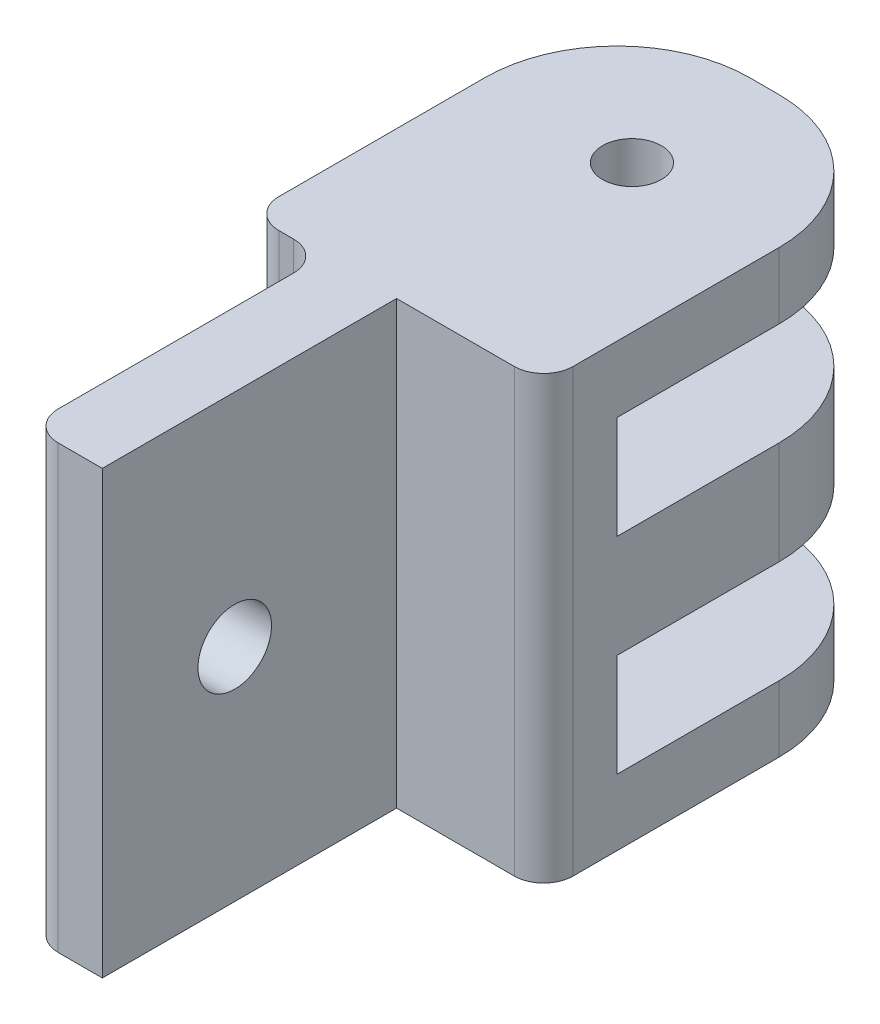
ISO-10303-21;
HEADER;
FILE_DESCRIPTION(('STEP AP214'),'2;1');
FILE_NAME('part.step','',(''),(''),'','','');
FILE_SCHEMA(('AUTOMOTIVE_DESIGN { 1 0 10303 214 1 1 1 1 }'));
ENDSEC;
DATA;
#1=APPLICATION_CONTEXT('core data for automotive mechanical design processes');
#2=APPLICATION_PROTOCOL_DEFINITION('international standard','automotive_design',2000,#1);
#3=PRODUCT_CONTEXT('',#1,'mechanical');
#4=PRODUCT('Part','Part','',(#3));
#5=PRODUCT_RELATED_PRODUCT_CATEGORY('part','',(#4));
#6=PRODUCT_DEFINITION_FORMATION('','',#4);
#7=PRODUCT_DEFINITION_CONTEXT('part definition',#1,'design');
#8=PRODUCT_DEFINITION('design','',#6,#7);
#9=PRODUCT_DEFINITION_SHAPE('','',#8);
#10=(LENGTH_UNIT() NAMED_UNIT(*) SI_UNIT(.MILLI.,.METRE.));
#11=(NAMED_UNIT(*) PLANE_ANGLE_UNIT() SI_UNIT($,.RADIAN.));
#12=(NAMED_UNIT(*) SI_UNIT($,.STERADIAN.) SOLID_ANGLE_UNIT());
#13=UNCERTAINTY_MEASURE_WITH_UNIT(LENGTH_MEASURE(1.E-05),#10,'distance_accuracy_value','');
#14=(GEOMETRIC_REPRESENTATION_CONTEXT(3) GLOBAL_UNCERTAINTY_ASSIGNED_CONTEXT((#13)) GLOBAL_UNIT_ASSIGNED_CONTEXT((#10,
#11,#12)) REPRESENTATION_CONTEXT('',''));
#15=CARTESIAN_POINT('',(0.,0.,0.));
#16=DIRECTION('',(0.,0.,1.));
#17=DIRECTION('',(1.,0.,0.));
#18=AXIS2_PLACEMENT_3D('',#15,#16,#17);
#19=CARTESIAN_POINT('',(0.,0.,25.));
#20=DIRECTION('',(0.,0.,-1.));
#21=DIRECTION('',(-1.,0.,0.));
#22=AXIS2_PLACEMENT_3D('',#19,#20,#21);
#23=PLANE('',#22);
#24=DIRECTION('',(1.,0.,0.));
#25=VECTOR('',#24,1.);
#26=CARTESIAN_POINT('',(-10.,-15.,25.));
#27=LINE('',#26,#25);
#28=CARTESIAN_POINT('',(0.,-15.,25.));
#29=VERTEX_POINT('',#28);
#30=CARTESIAN_POINT('',(8.,-15.,25.));
#31=VERTEX_POINT('',#30);
#32=EDGE_CURVE('E329',#29,#31,#27,.T.);
#33=ORIENTED_EDGE('',*,*,#32,.T.);
#34=DIRECTION('',(0.,1.,0.));
#35=VECTOR('',#34,1.);
#36=CARTESIAN_POINT('',(8.,0.,25.));
#37=LINE('',#36,#35);
#38=CARTESIAN_POINT('',(8.,15.,25.));
#39=VERTEX_POINT('',#38);
#40=EDGE_CURVE('E472',#31,#39,#37,.T.);
#41=ORIENTED_EDGE('',*,*,#40,.T.);
#42=DIRECTION('',(-1.,0.,0.));
#43=VECTOR('',#42,1.);
#44=CARTESIAN_POINT('',(-10.,15.,25.));
#45=LINE('',#44,#43);
#46=CARTESIAN_POINT('',(0.,15.,25.));
#47=VERTEX_POINT('',#46);
#48=EDGE_CURVE('E326',#39,#47,#45,.T.);
#49=ORIENTED_EDGE('',*,*,#48,.T.);
#50=DIRECTION('',(0.,1.,0.));
#51=VECTOR('',#50,1.);
#52=CARTESIAN_POINT('',(0.,-15.,25.));
#53=LINE('',#52,#51);
#54=EDGE_CURVE('E236',#29,#47,#53,.T.);
#55=ORIENTED_EDGE('',*,*,#54,.F.);
#56=EDGE_LOOP('',(#33,#41,#49,#55));
#57=FACE_BOUND('',#56,.T.);
#58=ADVANCED_FACE('F43',(#57),#23,.F.);
#59=CARTESIAN_POINT('',(-7.,15.,25.));
#60=VERTEX_POINT('',#59);
#61=CARTESIAN_POINT('',(-8.,15.,25.));
#62=VERTEX_POINT('',#61);
#63=EDGE_CURVE('E330',#60,#62,#45,.T.);
#64=ORIENTED_EDGE('',*,*,#63,.T.);
#65=DIRECTION('',(0.,-1.,0.));
#66=VECTOR('',#65,1.);
#67=CARTESIAN_POINT('',(-8.,0.,25.));
#68=LINE('',#67,#66);
#69=CARTESIAN_POINT('',(-8.,-15.,25.));
#70=VERTEX_POINT('',#69);
#71=EDGE_CURVE('E448',#62,#70,#68,.T.);
#72=ORIENTED_EDGE('',*,*,#71,.T.);
#73=CARTESIAN_POINT('',(-7.,-15.,25.));
#74=VERTEX_POINT('',#73);
#75=EDGE_CURVE('E331',#70,#74,#27,.T.);
#76=ORIENTED_EDGE('',*,*,#75,.T.);
#77=DIRECTION('',(0.,-1.,0.));
#78=VECTOR('',#77,1.);
#79=CARTESIAN_POINT('',(-7.,15.,25.));
#80=LINE('',#79,#78);
#81=EDGE_CURVE('E440',#74,#60,#80,.F.);
#82=ORIENTED_EDGE('',*,*,#81,.T.);
#83=EDGE_LOOP('',(#64,#72,#76,#82));
#84=FACE_BOUND('',#83,.T.);
#85=ADVANCED_FACE('F497',(#84),#23,.F.);
#86=CARTESIAN_POINT('',(0.,0.,0.));
#87=DIRECTION('',(0.,0.,-1.));
#88=DIRECTION('',(-1.,0.,0.));
#89=AXIS2_PLACEMENT_3D('',#86,#87,#88);
#90=PLANE('',#89);
#91=DIRECTION('',(1.,0.,0.));
#92=VECTOR('',#91,1.);
#93=CARTESIAN_POINT('',(10.,10.5,0.));
#94=LINE('',#93,#92);
#95=CARTESIAN_POINT('',(-1.,10.5,0.));
#96=VERTEX_POINT('',#95);
#97=CARTESIAN_POINT('',(1.,10.5,0.));
#98=VERTEX_POINT('',#97);
#99=EDGE_CURVE('E257',#96,#98,#94,.T.);
#100=ORIENTED_EDGE('',*,*,#99,.F.);
#101=DIRECTION('',(0.,-1.,0.));
#102=VECTOR('',#101,1.);
#103=CARTESIAN_POINT('',(-1.,15.,0.));
#104=LINE('',#103,#102);
#105=CARTESIAN_POINT('',(-1.,15.,0.));
#106=VERTEX_POINT('',#105);
#107=EDGE_CURVE('E430',#96,#106,#104,.F.);
#108=ORIENTED_EDGE('',*,*,#107,.T.);
#109=DIRECTION('',(-1.,0.,0.));
#110=VECTOR('',#109,1.);
#111=CARTESIAN_POINT('',(-10.,15.,0.));
#112=LINE('',#111,#110);
#113=CARTESIAN_POINT('',(1.,15.,0.));
#114=VERTEX_POINT('',#113);
#115=EDGE_CURVE('E281',#114,#106,#112,.T.);
#116=ORIENTED_EDGE('',*,*,#115,.F.);
#117=DIRECTION('',(0.,1.,0.));
#118=VECTOR('',#117,1.);
#119=CARTESIAN_POINT('',(1.,10.5,0.));
#120=LINE('',#119,#118);
#121=EDGE_CURVE('E427',#114,#98,#120,.F.);
#122=ORIENTED_EDGE('',*,*,#121,.T.);
#123=EDGE_LOOP('',(#100,#108,#116,#122));
#124=FACE_BOUND('',#123,.T.);
#125=ADVANCED_FACE('F548',(#124),#90,.T.);
#126=DIRECTION('',(-1.,0.,0.));
#127=VECTOR('',#126,1.);
#128=CARTESIAN_POINT('',(-10.,-10.5,0.));
#129=LINE('',#128,#127);
#130=CARTESIAN_POINT('',(1.,-10.5,0.));
#131=VERTEX_POINT('',#130);
#132=CARTESIAN_POINT('',(-1.,-10.5,0.));
#133=VERTEX_POINT('',#132);
#134=EDGE_CURVE('E305',#131,#133,#129,.T.);
#135=ORIENTED_EDGE('',*,*,#134,.F.);
#136=DIRECTION('',(0.,1.,0.));
#137=VECTOR('',#136,1.);
#138=CARTESIAN_POINT('',(1.,-15.,0.));
#139=LINE('',#138,#137);
#140=CARTESIAN_POINT('',(1.,-15.,0.));
#141=VERTEX_POINT('',#140);
#142=EDGE_CURVE('E381',#131,#141,#139,.F.);
#143=ORIENTED_EDGE('',*,*,#142,.T.);
#144=DIRECTION('',(1.,0.,0.));
#145=VECTOR('',#144,1.);
#146=CARTESIAN_POINT('',(-10.,-15.,0.));
#147=LINE('',#146,#145);
#148=CARTESIAN_POINT('',(-1.,-15.,0.));
#149=VERTEX_POINT('',#148);
#150=EDGE_CURVE('E339',#149,#141,#147,.T.);
#151=ORIENTED_EDGE('',*,*,#150,.F.);
#152=DIRECTION('',(0.,-1.,0.));
#153=VECTOR('',#152,1.);
#154=CARTESIAN_POINT('',(-1.,-10.5,0.));
#155=LINE('',#154,#153);
#156=EDGE_CURVE('E378',#149,#133,#155,.F.);
#157=ORIENTED_EDGE('',*,*,#156,.T.);
#158=EDGE_LOOP('',(#135,#143,#151,#157));
#159=FACE_BOUND('',#158,.T.);
#160=ADVANCED_FACE('F521',(#159),#90,.T.);
#161=CARTESIAN_POINT('',(10.,-15.,25.));
#162=DIRECTION('',(-1.,0.,0.));
#163=DIRECTION('',(0.,0.,1.));
#164=AXIS2_PLACEMENT_3D('',#161,#162,#163);
#165=PLANE('',#164);
#166=DIRECTION('',(0.,0.,-1.));
#167=VECTOR('',#166,1.);
#168=CARTESIAN_POINT('',(10.,15.,25.));
#169=LINE('',#168,#167);
#170=CARTESIAN_POINT('',(10.,15.,23.));
#171=VERTEX_POINT('',#170);
#172=CARTESIAN_POINT('',(10.,15.,9.));
#173=VERTEX_POINT('',#172);
#174=EDGE_CURVE('E351',#171,#173,#169,.T.);
#175=ORIENTED_EDGE('',*,*,#174,.F.);
#176=DIRECTION('',(0.,1.,0.));
#177=VECTOR('',#176,1.);
#178=CARTESIAN_POINT('',(10.,-15.,23.));
#179=LINE('',#178,#177);
#180=CARTESIAN_POINT('',(10.,-15.,23.));
#181=VERTEX_POINT('',#180);
#182=EDGE_CURVE('E479',#171,#181,#179,.F.);
#183=ORIENTED_EDGE('',*,*,#182,.T.);
#184=DIRECTION('',(0.,0.,-1.));
#185=VECTOR('',#184,1.);
#186=CARTESIAN_POINT('',(10.,-15.,25.));
#187=LINE('',#186,#185);
#188=CARTESIAN_POINT('',(10.,-15.,9.));
#189=VERTEX_POINT('',#188);
#190=EDGE_CURVE('E335',#181,#189,#187,.T.);
#191=ORIENTED_EDGE('',*,*,#190,.T.);
#192=DIRECTION('',(0.,1.,0.));
#193=VECTOR('',#192,1.);
#194=CARTESIAN_POINT('',(10.,-10.5,9.));
#195=LINE('',#194,#193);
#196=CARTESIAN_POINT('',(10.,-10.5,9.));
#197=VERTEX_POINT('',#196);
#198=EDGE_CURVE('E368',#189,#197,#195,.T.);
#199=ORIENTED_EDGE('',*,*,#198,.T.);
#200=DIRECTION('',(0.,0.,-1.));
#201=VECTOR('',#200,1.);
#202=CARTESIAN_POINT('',(10.,-10.5,20.));
#203=LINE('',#202,#201);
#204=CARTESIAN_POINT('',(10.,-10.5,20.));
#205=VERTEX_POINT('',#204);
#206=EDGE_CURVE('E246',#205,#197,#203,.T.);
#207=ORIENTED_EDGE('',*,*,#206,.F.);
#208=DIRECTION('',(0.,-1.,0.));
#209=VECTOR('',#208,1.);
#210=CARTESIAN_POINT('',(10.,-3.50245487564618,20.));
#211=LINE('',#210,#209);
#212=CARTESIAN_POINT('',(10.,-3.50245487564618,20.));
#213=VERTEX_POINT('',#212);
#214=EDGE_CURVE('E316',#213,#205,#211,.T.);
#215=ORIENTED_EDGE('',*,*,#214,.F.);
#216=DIRECTION('',(0.,0.,-1.));
#217=VECTOR('',#216,1.);
#218=CARTESIAN_POINT('',(10.,-3.50245487564618,20.));
#219=LINE('',#218,#217);
#220=CARTESIAN_POINT('',(10.,-3.50245487564618,9.));
#221=VERTEX_POINT('',#220);
#222=EDGE_CURVE('E298',#213,#221,#219,.T.);
#223=ORIENTED_EDGE('',*,*,#222,.T.);
#224=DIRECTION('',(0.,1.,0.));
#225=VECTOR('',#224,1.);
#226=CARTESIAN_POINT('',(10.,3.5,9.));
#227=LINE('',#226,#225);
#228=CARTESIAN_POINT('',(10.,3.5,9.));
#229=VERTEX_POINT('',#228);
#230=EDGE_CURVE('E364',#221,#229,#227,.T.);
#231=ORIENTED_EDGE('',*,*,#230,.T.);
#232=DIRECTION('',(0.,0.,-1.));
#233=VECTOR('',#232,1.);
#234=CARTESIAN_POINT('',(10.,3.5,20.));
#235=LINE('',#234,#233);
#236=CARTESIAN_POINT('',(10.,3.5,20.));
#237=VERTEX_POINT('',#236);
#238=EDGE_CURVE('E268',#237,#229,#235,.T.);
#239=ORIENTED_EDGE('',*,*,#238,.F.);
#240=DIRECTION('',(0.,-1.,0.));
#241=VECTOR('',#240,1.);
#242=CARTESIAN_POINT('',(10.,10.5,20.));
#243=LINE('',#242,#241);
#244=CARTESIAN_POINT('',(10.,10.5,20.));
#245=VERTEX_POINT('',#244);
#246=EDGE_CURVE('E252',#245,#237,#243,.T.);
#247=ORIENTED_EDGE('',*,*,#246,.F.);
#248=DIRECTION('',(0.,0.,-1.));
#249=VECTOR('',#248,1.);
#250=CARTESIAN_POINT('',(10.,10.5,20.));
#251=LINE('',#250,#249);
#252=CARTESIAN_POINT('',(10.,10.5,9.));
#253=VERTEX_POINT('',#252);
#254=EDGE_CURVE('E277',#245,#253,#251,.T.);
#255=ORIENTED_EDGE('',*,*,#254,.T.);
#256=DIRECTION('',(0.,1.,0.));
#257=VECTOR('',#256,1.);
#258=CARTESIAN_POINT('',(10.,15.,9.));
#259=LINE('',#258,#257);
#260=EDGE_CURVE('E354',#253,#173,#259,.T.);
#261=ORIENTED_EDGE('',*,*,#260,.T.);
#262=EDGE_LOOP('',(#175,#183,#191,#199,#207,#215,#223,#231,#239,#247,#255,#261));
#263=FACE_BOUND('',#262,.T.);
#264=ADVANCED_FACE('F537',(#263),#165,.F.);
#265=CARTESIAN_POINT('',(-10.,15.,25.));
#266=DIRECTION('',(0.,-1.,0.));
#267=DIRECTION('',(0.,0.,-1.));
#268=AXIS2_PLACEMENT_3D('',#265,#266,#267);
#269=PLANE('',#268);
#270=CARTESIAN_POINT('',(0.,15.,9.00000000000006));
#271=DIRECTION('',(0.,-1.,0.));
#272=DIRECTION('',(0.,0.,-1.));
#273=AXIS2_PLACEMENT_3D('',#270,#271,#272);
#274=CIRCLE('',#273,2.);
#275=CARTESIAN_POINT('',(0.,15.,7.00000000000006));
#276=VERTEX_POINT('',#275);
#277=EDGE_CURVE('E360',#276,#276,#274,.F.);
#278=ORIENTED_EDGE('',*,*,#277,.F.);
#279=EDGE_LOOP('',(#278));
#280=FACE_BOUND('',#279,.T.);
#281=DIRECTION('',(0.,0.,-1.));
#282=VECTOR('',#281,1.);
#283=CARTESIAN_POINT('',(-5.,15.,45.));
#284=LINE('',#283,#282);
#285=CARTESIAN_POINT('',(-5.,15.,43.));
#286=VERTEX_POINT('',#285);
#287=CARTESIAN_POINT('',(-5.,15.,27.));
#288=VERTEX_POINT('',#287);
#289=EDGE_CURVE('E241',#286,#288,#284,.T.);
#290=ORIENTED_EDGE('',*,*,#289,.F.);
#291=CARTESIAN_POINT('',(-3.,15.,43.));
#292=DIRECTION('',(0.,-1.,0.));
#293=DIRECTION('',(0.,0.,-1.));
#294=AXIS2_PLACEMENT_3D('',#291,#292,#293);
#295=CIRCLE('',#294,2.);
#296=CARTESIAN_POINT('',(-3.,15.,45.));
#297=VERTEX_POINT('',#296);
#298=EDGE_CURVE('E11',#286,#297,#295,.F.);
#299=ORIENTED_EDGE('',*,*,#298,.T.);
#300=DIRECTION('',(-1.,0.,0.));
#301=VECTOR('',#300,1.);
#302=CARTESIAN_POINT('',(0.,15.,45.));
#303=LINE('',#302,#301);
#304=CARTESIAN_POINT('',(0.,15.,45.));
#305=VERTEX_POINT('',#304);
#306=EDGE_CURVE('E215',#305,#297,#303,.T.);
#307=ORIENTED_EDGE('',*,*,#306,.F.);
#308=DIRECTION('',(0.,0.,-1.));
#309=VECTOR('',#308,1.);
#310=CARTESIAN_POINT('',(0.,15.,45.));
#311=LINE('',#310,#309);
#312=EDGE_CURVE('E220',#305,#47,#311,.T.);
#313=ORIENTED_EDGE('',*,*,#312,.T.);
#314=ORIENTED_EDGE('',*,*,#48,.F.);
#315=CARTESIAN_POINT('',(8.,15.,23.));
#316=DIRECTION('',(0.,-1.,0.));
#317=DIRECTION('',(0.,0.,-1.));
#318=AXIS2_PLACEMENT_3D('',#315,#316,#317);
#319=CIRCLE('',#318,2.);
#320=EDGE_CURVE('E476',#39,#171,#319,.F.);
#321=ORIENTED_EDGE('',*,*,#320,.T.);
#322=ORIENTED_EDGE('',*,*,#174,.T.);
#323=CARTESIAN_POINT('',(1.,15.,9.));
#324=DIRECTION('',(0.,-1.,0.));
#325=DIRECTION('',(0.,0.,-1.));
#326=AXIS2_PLACEMENT_3D('',#323,#324,#325);
#327=CIRCLE('',#326,9.);
#328=EDGE_CURVE('E433',#173,#114,#327,.F.);
#329=ORIENTED_EDGE('',*,*,#328,.T.);
#330=ORIENTED_EDGE('',*,*,#115,.T.);
#331=CARTESIAN_POINT('',(-1.,15.,9.));
#332=DIRECTION('',(0.,-1.,0.));
#333=DIRECTION('',(0.,0.,-1.));
#334=AXIS2_PLACEMENT_3D('',#331,#332,#333);
#335=CIRCLE('',#334,9.);
#336=CARTESIAN_POINT('',(-10.,15.,9.));
#337=VERTEX_POINT('',#336);
#338=EDGE_CURVE('E436',#106,#337,#335,.F.);
#339=ORIENTED_EDGE('',*,*,#338,.T.);
#340=DIRECTION('',(0.,0.,-1.));
#341=VECTOR('',#340,1.);
#342=CARTESIAN_POINT('',(-10.,15.,25.));
#343=LINE('',#342,#341);
#344=CARTESIAN_POINT('',(-10.,15.,23.));
#345=VERTEX_POINT('',#344);
#346=EDGE_CURVE('E348',#345,#337,#343,.T.);
#347=ORIENTED_EDGE('',*,*,#346,.F.);
#348=CARTESIAN_POINT('',(-8.,15.,23.));
#349=DIRECTION('',(0.,-1.,0.));
#350=DIRECTION('',(0.,0.,-1.));
#351=AXIS2_PLACEMENT_3D('',#348,#349,#350);
#352=CIRCLE('',#351,2.);
#353=EDGE_CURVE('E458',#345,#62,#352,.F.);
#354=ORIENTED_EDGE('',*,*,#353,.T.);
#355=ORIENTED_EDGE('',*,*,#63,.F.);
#356=CARTESIAN_POINT('',(-7.,15.,27.));
#357=DIRECTION('',(0.,-1.,0.));
#358=DIRECTION('',(0.,0.,-1.));
#359=AXIS2_PLACEMENT_3D('',#356,#357,#358);
#360=CIRCLE('',#359,2.);
#361=EDGE_CURVE('E468',#60,#288,#360,.T.);
#362=ORIENTED_EDGE('',*,*,#361,.T.);
#363=EDGE_LOOP('',(#290,#299,#307,#313,#314,#321,#322,#329,#330,#339,#347,#354,#355,#362));
#364=FACE_BOUND('',#363,.T.);
#365=ADVANCED_FACE('F217',(#280,#364),#269,.F.);
#366=CARTESIAN_POINT('',(-10.,-15.,25.));
#367=DIRECTION('',(1.,0.,0.));
#368=DIRECTION('',(0.,0.,-1.));
#369=AXIS2_PLACEMENT_3D('',#366,#367,#368);
#370=PLANE('',#369);
#371=DIRECTION('',(0.,0.,-1.));
#372=VECTOR('',#371,1.);
#373=CARTESIAN_POINT('',(-10.,-15.,25.));
#374=LINE('',#373,#372);
#375=CARTESIAN_POINT('',(-10.,-15.,23.));
#376=VERTEX_POINT('',#375);
#377=CARTESIAN_POINT('',(-10.,-15.,9.));
#378=VERTEX_POINT('',#377);
#379=EDGE_CURVE('E345',#376,#378,#374,.T.);
#380=ORIENTED_EDGE('',*,*,#379,.F.);
#381=DIRECTION('',(0.,-1.,0.));
#382=VECTOR('',#381,1.);
#383=CARTESIAN_POINT('',(-10.,-15.,23.));
#384=LINE('',#383,#382);
#385=EDGE_CURVE('E455',#376,#345,#384,.F.);
#386=ORIENTED_EDGE('',*,*,#385,.T.);
#387=ORIENTED_EDGE('',*,*,#346,.T.);
#388=DIRECTION('',(0.,-1.,0.));
#389=VECTOR('',#388,1.);
#390=CARTESIAN_POINT('',(-10.,10.5,9.));
#391=LINE('',#390,#389);
#392=CARTESIAN_POINT('',(-10.,10.5,9.));
#393=VERTEX_POINT('',#392);
#394=EDGE_CURVE('E391',#337,#393,#391,.T.);
#395=ORIENTED_EDGE('',*,*,#394,.T.);
#396=DIRECTION('',(0.,0.,-1.));
#397=VECTOR('',#396,1.);
#398=CARTESIAN_POINT('',(-10.,10.5,20.));
#399=LINE('',#398,#397);
#400=CARTESIAN_POINT('',(-10.,10.5,20.));
#401=VERTEX_POINT('',#400);
#402=EDGE_CURVE('E282',#401,#393,#399,.T.);
#403=ORIENTED_EDGE('',*,*,#402,.F.);
#404=DIRECTION('',(0.,1.,0.));
#405=VECTOR('',#404,1.);
#406=CARTESIAN_POINT('',(-10.,10.5,20.));
#407=LINE('',#406,#405);
#408=CARTESIAN_POINT('',(-10.,3.5,20.));
#409=VERTEX_POINT('',#408);
#410=EDGE_CURVE('E261',#409,#401,#407,.T.);
#411=ORIENTED_EDGE('',*,*,#410,.F.);
#412=DIRECTION('',(0.,0.,-1.));
#413=VECTOR('',#412,1.);
#414=CARTESIAN_POINT('',(-10.,3.5,20.));
#415=LINE('',#414,#413);
#416=CARTESIAN_POINT('',(-10.,3.5,9.));
#417=VERTEX_POINT('',#416);
#418=EDGE_CURVE('E286',#409,#417,#415,.T.);
#419=ORIENTED_EDGE('',*,*,#418,.T.);
#420=DIRECTION('',(0.,-1.,0.));
#421=VECTOR('',#420,1.);
#422=CARTESIAN_POINT('',(-10.,-3.50245487564618,9.));
#423=LINE('',#422,#421);
#424=CARTESIAN_POINT('',(-10.,-3.50245487564618,9.));
#425=VERTEX_POINT('',#424);
#426=EDGE_CURVE('E395',#417,#425,#423,.T.);
#427=ORIENTED_EDGE('',*,*,#426,.T.);
#428=DIRECTION('',(0.,0.,-1.));
#429=VECTOR('',#428,1.);
#430=CARTESIAN_POINT('',(-10.,-3.50245487564618,20.));
#431=LINE('',#430,#429);
#432=CARTESIAN_POINT('',(-10.,-3.50245487564618,20.));
#433=VERTEX_POINT('',#432);
#434=EDGE_CURVE('E293',#433,#425,#431,.T.);
#435=ORIENTED_EDGE('',*,*,#434,.F.);
#436=DIRECTION('',(0.,1.,0.));
#437=VECTOR('',#436,1.);
#438=CARTESIAN_POINT('',(-10.,-3.50245487564618,20.));
#439=LINE('',#438,#437);
#440=CARTESIAN_POINT('',(-10.,-10.5,20.));
#441=VERTEX_POINT('',#440);
#442=EDGE_CURVE('E309',#441,#433,#439,.T.);
#443=ORIENTED_EDGE('',*,*,#442,.F.);
#444=DIRECTION('',(0.,0.,-1.));
#445=VECTOR('',#444,1.);
#446=CARTESIAN_POINT('',(-10.,-10.5,20.));
#447=LINE('',#446,#445);
#448=CARTESIAN_POINT('',(-10.,-10.5,9.));
#449=VERTEX_POINT('',#448);
#450=EDGE_CURVE('E240',#441,#449,#447,.T.);
#451=ORIENTED_EDGE('',*,*,#450,.T.);
#452=DIRECTION('',(0.,-1.,0.));
#453=VECTOR('',#452,1.);
#454=CARTESIAN_POINT('',(-10.,-15.,9.));
#455=LINE('',#454,#453);
#456=EDGE_CURVE('E399',#449,#378,#455,.T.);
#457=ORIENTED_EDGE('',*,*,#456,.T.);
#458=EDGE_LOOP('',(#380,#386,#387,#395,#403,#411,#419,#427,#435,#443,#451,#457));
#459=FACE_BOUND('',#458,.T.);
#460=ADVANCED_FACE('F509',(#459),#370,.F.);
#461=CARTESIAN_POINT('',(-10.,-15.,25.));
#462=DIRECTION('',(0.,1.,0.));
#463=DIRECTION('',(0.,0.,1.));
#464=AXIS2_PLACEMENT_3D('',#461,#462,#463);
#465=PLANE('',#464);
#466=CARTESIAN_POINT('',(0.,-15.,9.00000000000006));
#467=DIRECTION('',(0.,1.,0.));
#468=DIRECTION('',(0.,0.,1.));
#469=AXIS2_PLACEMENT_3D('',#466,#467,#468);
#470=CIRCLE('',#469,2.);
#471=CARTESIAN_POINT('',(0.,-15.,11.0000000000001));
#472=VERTEX_POINT('',#471);
#473=EDGE_CURVE('E690',#472,#472,#470,.F.);
#474=ORIENTED_EDGE('',*,*,#473,.F.);
#475=EDGE_LOOP('',(#474));
#476=FACE_BOUND('',#475,.T.);
#477=DIRECTION('',(1.,0.,0.));
#478=VECTOR('',#477,1.);
#479=CARTESIAN_POINT('',(0.,-15.,45.));
#480=LINE('',#479,#478);
#481=CARTESIAN_POINT('',(-3.,-15.,45.));
#482=VERTEX_POINT('',#481);
#483=CARTESIAN_POINT('',(0.,-15.,45.));
#484=VERTEX_POINT('',#483);
#485=EDGE_CURVE('E227',#482,#484,#480,.T.);
#486=ORIENTED_EDGE('',*,*,#485,.F.);
#487=CARTESIAN_POINT('',(-3.,-15.,43.));
#488=DIRECTION('',(0.,1.,0.));
#489=DIRECTION('',(0.,0.,1.));
#490=AXIS2_PLACEMENT_3D('',#487,#488,#489);
#491=CIRCLE('',#490,2.);
#492=CARTESIAN_POINT('',(-5.,-15.,43.));
#493=VERTEX_POINT('',#492);
#494=EDGE_CURVE('E66',#482,#493,#491,.F.);
#495=ORIENTED_EDGE('',*,*,#494,.T.);
#496=DIRECTION('',(0.,0.,-1.));
#497=VECTOR('',#496,1.);
#498=CARTESIAN_POINT('',(-5.,-15.,45.));
#499=LINE('',#498,#497);
#500=CARTESIAN_POINT('',(-5.,-15.,27.));
#501=VERTEX_POINT('',#500);
#502=EDGE_CURVE('E248',#493,#501,#499,.T.);
#503=ORIENTED_EDGE('',*,*,#502,.T.);
#504=CARTESIAN_POINT('',(-7.,-15.,27.));
#505=DIRECTION('',(0.,1.,0.));
#506=DIRECTION('',(0.,0.,1.));
#507=AXIS2_PLACEMENT_3D('',#504,#505,#506);
#508=CIRCLE('',#507,2.);
#509=EDGE_CURVE('E465',#501,#74,#508,.T.);
#510=ORIENTED_EDGE('',*,*,#509,.T.);
#511=ORIENTED_EDGE('',*,*,#75,.F.);
#512=CARTESIAN_POINT('',(-8.,-15.,23.));
#513=DIRECTION('',(0.,1.,0.));
#514=DIRECTION('',(0.,0.,1.));
#515=AXIS2_PLACEMENT_3D('',#512,#513,#514);
#516=CIRCLE('',#515,2.);
#517=EDGE_CURVE('E452',#70,#376,#516,.F.);
#518=ORIENTED_EDGE('',*,*,#517,.T.);
#519=ORIENTED_EDGE('',*,*,#379,.T.);
#520=CARTESIAN_POINT('',(-1.,-15.,9.));
#521=DIRECTION('',(0.,1.,0.));
#522=DIRECTION('',(0.,0.,1.));
#523=AXIS2_PLACEMENT_3D('',#520,#521,#522);
#524=CIRCLE('',#523,9.);
#525=EDGE_CURVE('E384',#378,#149,#524,.F.);
#526=ORIENTED_EDGE('',*,*,#525,.T.);
#527=ORIENTED_EDGE('',*,*,#150,.T.);
#528=CARTESIAN_POINT('',(1.,-15.,9.));
#529=DIRECTION('',(0.,1.,0.));
#530=DIRECTION('',(0.,0.,1.));
#531=AXIS2_PLACEMENT_3D('',#528,#529,#530);
#532=CIRCLE('',#531,9.);
#533=EDGE_CURVE('E387',#141,#189,#532,.F.);
#534=ORIENTED_EDGE('',*,*,#533,.T.);
#535=ORIENTED_EDGE('',*,*,#190,.F.);
#536=CARTESIAN_POINT('',(8.,-15.,23.));
#537=DIRECTION('',(0.,1.,0.));
#538=DIRECTION('',(0.,0.,1.));
#539=AXIS2_PLACEMENT_3D('',#536,#537,#538);
#540=CIRCLE('',#539,2.);
#541=EDGE_CURVE('E482',#181,#31,#540,.F.);
#542=ORIENTED_EDGE('',*,*,#541,.T.);
#543=ORIENTED_EDGE('',*,*,#32,.F.);
#544=DIRECTION('',(0.,0.,-1.));
#545=VECTOR('',#544,1.);
#546=CARTESIAN_POINT('',(0.,-15.,45.));
#547=LINE('',#546,#545);
#548=EDGE_CURVE('E642',#484,#29,#547,.T.);
#549=ORIENTED_EDGE('',*,*,#548,.F.);
#550=EDGE_LOOP('',(#486,#495,#503,#510,#511,#518,#519,#526,#527,#534,#535,#542,#543,#549));
#551=FACE_BOUND('',#550,.T.);
#552=ADVANCED_FACE('F506',(#476,#551),#465,.F.);
#553=DIRECTION('',(1.,0.,0.));
#554=VECTOR('',#553,1.);
#555=CARTESIAN_POINT('',(-10.,-3.50245487564618,0.));
#556=LINE('',#555,#554);
#557=CARTESIAN_POINT('',(-1.,-3.50245487564618,0.));
#558=VERTEX_POINT('',#557);
#559=CARTESIAN_POINT('',(1.,-3.50245487564618,0.));
#560=VERTEX_POINT('',#559);
#561=EDGE_CURVE('E273',#558,#560,#556,.T.);
#562=ORIENTED_EDGE('',*,*,#561,.F.);
#563=DIRECTION('',(0.,-1.,0.));
#564=VECTOR('',#563,1.);
#565=CARTESIAN_POINT('',(-1.,3.5,0.));
#566=LINE('',#565,#564);
#567=CARTESIAN_POINT('',(-1.,3.5,0.));
#568=VERTEX_POINT('',#567);
#569=EDGE_CURVE('E412',#558,#568,#566,.F.);
#570=ORIENTED_EDGE('',*,*,#569,.T.);
#571=DIRECTION('',(-1.,0.,0.));
#572=VECTOR('',#571,1.);
#573=CARTESIAN_POINT('',(10.,3.5,0.));
#574=LINE('',#573,#572);
#575=CARTESIAN_POINT('',(1.,3.5,0.));
#576=VERTEX_POINT('',#575);
#577=EDGE_CURVE('E269',#576,#568,#574,.T.);
#578=ORIENTED_EDGE('',*,*,#577,.F.);
#579=DIRECTION('',(0.,1.,0.));
#580=VECTOR('',#579,1.);
#581=CARTESIAN_POINT('',(1.,-3.50245487564618,0.));
#582=LINE('',#581,#580);
#583=EDGE_CURVE('E409',#576,#560,#582,.F.);
#584=ORIENTED_EDGE('',*,*,#583,.T.);
#585=EDGE_LOOP('',(#562,#570,#578,#584));
#586=FACE_BOUND('',#585,.T.);
#587=ADVANCED_FACE('F576',(#586),#90,.T.);
#588=CARTESIAN_POINT('',(-10.,-10.5,20.));
#589=DIRECTION('',(0.,-1.,0.));
#590=DIRECTION('',(1.,0.,0.));
#591=AXIS2_PLACEMENT_3D('',#588,#589,#590);
#592=PLANE('',#591);
#593=CARTESIAN_POINT('',(0.,-10.5,9.00000000000006));
#594=DIRECTION('',(0.,-1.,0.));
#595=DIRECTION('',(1.,0.,0.));
#596=AXIS2_PLACEMENT_3D('',#593,#594,#595);
#597=CIRCLE('',#596,2.);
#598=CARTESIAN_POINT('',(2.,-10.5,9.00000000000006));
#599=VERTEX_POINT('',#598);
#600=EDGE_CURVE('E685',#599,#599,#597,.F.);
#601=ORIENTED_EDGE('',*,*,#600,.F.);
#602=EDGE_LOOP('',(#601));
#603=FACE_BOUND('',#602,.T.);
#604=ORIENTED_EDGE('',*,*,#206,.T.);
#605=CARTESIAN_POINT('',(1.,-10.5,9.));
#606=DIRECTION('',(0.,-1.,0.));
#607=DIRECTION('',(1.,0.,0.));
#608=AXIS2_PLACEMENT_3D('',#605,#606,#607);
#609=CIRCLE('',#608,9.);
#610=EDGE_CURVE('E375',#197,#131,#609,.F.);
#611=ORIENTED_EDGE('',*,*,#610,.T.);
#612=ORIENTED_EDGE('',*,*,#134,.T.);
#613=CARTESIAN_POINT('',(-1.,-10.5,9.));
#614=DIRECTION('',(0.,-1.,0.));
#615=DIRECTION('',(1.,0.,0.));
#616=AXIS2_PLACEMENT_3D('',#613,#614,#615);
#617=CIRCLE('',#616,9.);
#618=EDGE_CURVE('E372',#133,#449,#617,.F.);
#619=ORIENTED_EDGE('',*,*,#618,.T.);
#620=ORIENTED_EDGE('',*,*,#450,.F.);
#621=DIRECTION('',(-1.,0.,0.));
#622=VECTOR('',#621,1.);
#623=CARTESIAN_POINT('',(-10.,-10.5,20.));
#624=LINE('',#623,#622);
#625=EDGE_CURVE('E297',#205,#441,#624,.T.);
#626=ORIENTED_EDGE('',*,*,#625,.F.);
#627=EDGE_LOOP('',(#604,#611,#612,#619,#620,#626));
#628=FACE_BOUND('',#627,.T.);
#629=ADVANCED_FACE('F586',(#603,#628),#592,.F.);
#630=CARTESIAN_POINT('',(-10.,-3.50245487564618,20.));
#631=DIRECTION('',(0.,1.,0.));
#632=DIRECTION('',(-1.,0.,0.));
#633=AXIS2_PLACEMENT_3D('',#630,#631,#632);
#634=PLANE('',#633);
#635=CARTESIAN_POINT('',(0.,-3.50245487564618,9.00000000000006));
#636=DIRECTION('',(0.,1.,0.));
#637=DIRECTION('',(-1.,0.,0.));
#638=AXIS2_PLACEMENT_3D('',#635,#636,#637);
#639=CIRCLE('',#638,2.);
#640=CARTESIAN_POINT('',(-2.,-3.50245487564618,9.00000000000006));
#641=VERTEX_POINT('',#640);
#642=EDGE_CURVE('E683',#641,#641,#639,.F.);
#643=ORIENTED_EDGE('',*,*,#642,.F.);
#644=EDGE_LOOP('',(#643));
#645=FACE_BOUND('',#644,.T.);
#646=ORIENTED_EDGE('',*,*,#434,.T.);
#647=CARTESIAN_POINT('',(-1.,-3.50245487564618,9.));
#648=DIRECTION('',(0.,1.,0.));
#649=DIRECTION('',(-1.,0.,0.));
#650=AXIS2_PLACEMENT_3D('',#647,#648,#649);
#651=CIRCLE('',#650,9.);
#652=EDGE_CURVE('E406',#425,#558,#651,.F.);
#653=ORIENTED_EDGE('',*,*,#652,.T.);
#654=ORIENTED_EDGE('',*,*,#561,.T.);
#655=CARTESIAN_POINT('',(1.,-3.50245487564618,9.));
#656=DIRECTION('',(0.,1.,0.));
#657=DIRECTION('',(-1.,0.,0.));
#658=AXIS2_PLACEMENT_3D('',#655,#656,#657);
#659=CIRCLE('',#658,9.);
#660=EDGE_CURVE('E403',#560,#221,#659,.F.);
#661=ORIENTED_EDGE('',*,*,#660,.T.);
#662=ORIENTED_EDGE('',*,*,#222,.F.);
#663=DIRECTION('',(1.,0.,0.));
#664=VECTOR('',#663,1.);
#665=CARTESIAN_POINT('',(-10.,-3.50245487564618,20.));
#666=LINE('',#665,#664);
#667=EDGE_CURVE('E319',#433,#213,#666,.T.);
#668=ORIENTED_EDGE('',*,*,#667,.F.);
#669=EDGE_LOOP('',(#646,#653,#654,#661,#662,#668));
#670=FACE_BOUND('',#669,.T.);
#671=ADVANCED_FACE('F573',(#645,#670),#634,.F.);
#672=CARTESIAN_POINT('',(0.,0.,20.));
#673=DIRECTION('',(0.,0.,1.));
#674=DIRECTION('',(1.,0.,0.));
#675=AXIS2_PLACEMENT_3D('',#672,#673,#674);
#676=PLANE('',#675);
#677=ORIENTED_EDGE('',*,*,#442,.T.);
#678=ORIENTED_EDGE('',*,*,#667,.T.);
#679=ORIENTED_EDGE('',*,*,#214,.T.);
#680=ORIENTED_EDGE('',*,*,#625,.T.);
#681=EDGE_LOOP('',(#677,#678,#679,#680));
#682=FACE_BOUND('',#681,.T.);
#683=ADVANCED_FACE('F584',(#682),#676,.F.);
#684=CARTESIAN_POINT('',(10.,10.5,20.));
#685=DIRECTION('',(0.,1.,0.));
#686=DIRECTION('',(0.,0.,1.));
#687=AXIS2_PLACEMENT_3D('',#684,#685,#686);
#688=PLANE('',#687);
#689=CARTESIAN_POINT('',(0.,10.5,9.00000000000006));
#690=DIRECTION('',(0.,1.,0.));
#691=DIRECTION('',(0.,0.,1.));
#692=AXIS2_PLACEMENT_3D('',#689,#690,#691);
#693=CIRCLE('',#692,2.);
#694=CARTESIAN_POINT('',(0.,10.5,11.0000000000001));
#695=VERTEX_POINT('',#694);
#696=EDGE_CURVE('E445',#695,#695,#693,.F.);
#697=ORIENTED_EDGE('',*,*,#696,.F.);
#698=EDGE_LOOP('',(#697));
#699=FACE_BOUND('',#698,.T.);
#700=ORIENTED_EDGE('',*,*,#402,.T.);
#701=CARTESIAN_POINT('',(-1.,10.5,9.));
#702=DIRECTION('',(0.,1.,0.));
#703=DIRECTION('',(0.,0.,1.));
#704=AXIS2_PLACEMENT_3D('',#701,#702,#703);
#705=CIRCLE('',#704,9.);
#706=EDGE_CURVE('E424',#393,#96,#705,.F.);
#707=ORIENTED_EDGE('',*,*,#706,.T.);
#708=ORIENTED_EDGE('',*,*,#99,.T.);
#709=CARTESIAN_POINT('',(1.,10.5,9.));
#710=DIRECTION('',(0.,1.,0.));
#711=DIRECTION('',(0.,0.,1.));
#712=AXIS2_PLACEMENT_3D('',#709,#710,#711);
#713=CIRCLE('',#712,9.);
#714=EDGE_CURVE('E421',#98,#253,#713,.F.);
#715=ORIENTED_EDGE('',*,*,#714,.T.);
#716=ORIENTED_EDGE('',*,*,#254,.F.);
#717=DIRECTION('',(1.,0.,0.));
#718=VECTOR('',#717,1.);
#719=CARTESIAN_POINT('',(10.,10.5,20.));
#720=LINE('',#719,#718);
#721=EDGE_CURVE('E264',#401,#245,#720,.T.);
#722=ORIENTED_EDGE('',*,*,#721,.F.);
#723=EDGE_LOOP('',(#700,#707,#708,#715,#716,#722));
#724=FACE_BOUND('',#723,.T.);
#725=ADVANCED_FACE('F557',(#699,#724),#688,.F.);
#726=CARTESIAN_POINT('',(10.,3.5,20.));
#727=DIRECTION('',(0.,-1.,0.));
#728=DIRECTION('',(1.,0.,0.));
#729=AXIS2_PLACEMENT_3D('',#726,#727,#728);
#730=PLANE('',#729);
#731=CARTESIAN_POINT('',(0.,3.5,9.00000000000006));
#732=DIRECTION('',(0.,-1.,0.));
#733=DIRECTION('',(1.,0.,0.));
#734=AXIS2_PLACEMENT_3D('',#731,#732,#733);
#735=CIRCLE('',#734,2.);
#736=CARTESIAN_POINT('',(2.,3.5,9.00000000000006));
#737=VERTEX_POINT('',#736);
#738=EDGE_CURVE('E441',#737,#737,#735,.F.);
#739=ORIENTED_EDGE('',*,*,#738,.F.);
#740=EDGE_LOOP('',(#739));
#741=FACE_BOUND('',#740,.T.);
#742=ORIENTED_EDGE('',*,*,#577,.T.);
#743=CARTESIAN_POINT('',(-1.,3.5,9.));
#744=DIRECTION('',(0.,-1.,0.));
#745=DIRECTION('',(1.,0.,0.));
#746=AXIS2_PLACEMENT_3D('',#743,#744,#745);
#747=CIRCLE('',#746,9.);
#748=EDGE_CURVE('E418',#568,#417,#747,.F.);
#749=ORIENTED_EDGE('',*,*,#748,.T.);
#750=ORIENTED_EDGE('',*,*,#418,.F.);
#751=DIRECTION('',(-1.,0.,0.));
#752=VECTOR('',#751,1.);
#753=CARTESIAN_POINT('',(10.,3.5,20.));
#754=LINE('',#753,#752);
#755=EDGE_CURVE('E256',#237,#409,#754,.T.);
#756=ORIENTED_EDGE('',*,*,#755,.F.);
#757=ORIENTED_EDGE('',*,*,#238,.T.);
#758=CARTESIAN_POINT('',(1.,3.5,9.));
#759=DIRECTION('',(0.,-1.,0.));
#760=DIRECTION('',(1.,0.,0.));
#761=AXIS2_PLACEMENT_3D('',#758,#759,#760);
#762=CIRCLE('',#761,9.);
#763=EDGE_CURVE('E415',#229,#576,#762,.F.);
#764=ORIENTED_EDGE('',*,*,#763,.T.);
#765=EDGE_LOOP('',(#742,#749,#750,#756,#757,#764));
#766=FACE_BOUND('',#765,.T.);
#767=ADVANCED_FACE('F563',(#741,#766),#730,.F.);
#768=CARTESIAN_POINT('',(0.,0.,20.));
#769=DIRECTION('',(0.,0.,-1.));
#770=DIRECTION('',(-1.,0.,0.));
#771=AXIS2_PLACEMENT_3D('',#768,#769,#770);
#772=PLANE('',#771);
#773=ORIENTED_EDGE('',*,*,#246,.T.);
#774=ORIENTED_EDGE('',*,*,#755,.T.);
#775=ORIENTED_EDGE('',*,*,#410,.T.);
#776=ORIENTED_EDGE('',*,*,#721,.T.);
#777=EDGE_LOOP('',(#773,#774,#775,#776));
#778=FACE_BOUND('',#777,.T.);
#779=ADVANCED_FACE('F559',(#778),#772,.T.);
#780=CARTESIAN_POINT('',(0.,-15.,45.));
#781=DIRECTION('',(-1.,0.,0.));
#782=DIRECTION('',(0.,-1.,0.));
#783=AXIS2_PLACEMENT_3D('',#780,#781,#782);
#784=PLANE('',#783);
#785=CARTESIAN_POINT('',(0.,0.,36.));
#786=DIRECTION('',(-1.,0.,0.));
#787=DIRECTION('',(0.,-1.,0.));
#788=AXIS2_PLACEMENT_3D('',#785,#786,#787);
#789=CIRCLE('',#788,2.5);
#790=CARTESIAN_POINT('',(0.,-2.5,36.));
#791=VERTEX_POINT('',#790);
#792=EDGE_CURVE('E359',#791,#791,#789,.F.);
#793=ORIENTED_EDGE('',*,*,#792,.F.);
#794=EDGE_LOOP('',(#793));
#795=FACE_BOUND('',#794,.T.);
#796=ORIENTED_EDGE('',*,*,#54,.T.);
#797=ORIENTED_EDGE('',*,*,#312,.F.);
#798=DIRECTION('',(0.,1.,0.));
#799=VECTOR('',#798,1.);
#800=CARTESIAN_POINT('',(0.,-15.,45.));
#801=LINE('',#800,#799);
#802=EDGE_CURVE('E228',#484,#305,#801,.T.);
#803=ORIENTED_EDGE('',*,*,#802,.F.);
#804=ORIENTED_EDGE('',*,*,#548,.T.);
#805=EDGE_LOOP('',(#796,#797,#803,#804));
#806=FACE_BOUND('',#805,.T.);
#807=ADVANCED_FACE('F238',(#795,#806),#784,.F.);
#808=CARTESIAN_POINT('',(-5.,-15.,45.));
#809=DIRECTION('',(1.,0.,0.));
#810=DIRECTION('',(0.,1.,0.));
#811=AXIS2_PLACEMENT_3D('',#808,#809,#810);
#812=PLANE('',#811);
#813=CARTESIAN_POINT('',(-5.,0.,36.));
#814=DIRECTION('',(1.,0.,0.));
#815=DIRECTION('',(0.,1.,0.));
#816=AXIS2_PLACEMENT_3D('',#813,#814,#815);
#817=CIRCLE('',#816,2.5);
#818=CARTESIAN_POINT('',(-5.,2.5,36.));
#819=VERTEX_POINT('',#818);
#820=EDGE_CURVE('E355',#819,#819,#817,.F.);
#821=ORIENTED_EDGE('',*,*,#820,.F.);
#822=EDGE_LOOP('',(#821));
#823=FACE_BOUND('',#822,.T.);
#824=ORIENTED_EDGE('',*,*,#502,.F.);
#825=DIRECTION('',(0.,-1.,0.));
#826=VECTOR('',#825,1.);
#827=CARTESIAN_POINT('',(-5.,15.,43.));
#828=LINE('',#827,#826);
#829=EDGE_CURVE('E52',#493,#286,#828,.F.);
#830=ORIENTED_EDGE('',*,*,#829,.T.);
#831=ORIENTED_EDGE('',*,*,#289,.T.);
#832=DIRECTION('',(0.,-1.,0.));
#833=VECTOR('',#832,1.);
#834=CARTESIAN_POINT('',(-5.,-15.,27.));
#835=LINE('',#834,#833);
#836=EDGE_CURVE('E461',#288,#501,#835,.T.);
#837=ORIENTED_EDGE('',*,*,#836,.T.);
#838=EDGE_LOOP('',(#824,#830,#831,#837));
#839=FACE_BOUND('',#838,.T.);
#840=ADVANCED_FACE('F652',(#823,#839),#812,.F.);
#841=CARTESIAN_POINT('',(0.,0.,45.));
#842=DIRECTION('',(0.,0.,1.));
#843=DIRECTION('',(1.,0.,0.));
#844=AXIS2_PLACEMENT_3D('',#841,#842,#843);
#845=PLANE('',#844);
#846=ORIENTED_EDGE('',*,*,#306,.T.);
#847=DIRECTION('',(0.,-1.,0.));
#848=VECTOR('',#847,1.);
#849=CARTESIAN_POINT('',(-3.,-15.,45.));
#850=LINE('',#849,#848);
#851=EDGE_CURVE('E485',#297,#482,#850,.T.);
#852=ORIENTED_EDGE('',*,*,#851,.T.);
#853=ORIENTED_EDGE('',*,*,#485,.T.);
#854=ORIENTED_EDGE('',*,*,#802,.T.);
#855=EDGE_LOOP('',(#846,#852,#853,#854));
#856=FACE_BOUND('',#855,.T.);
#857=ADVANCED_FACE('F231',(#856),#845,.T.);
#858=CARTESIAN_POINT('',(13.,0.,36.));
#859=DIRECTION('',(-1.,0.,0.));
#860=DIRECTION('',(0.,-1.,0.));
#861=AXIS2_PLACEMENT_3D('',#858,#859,#860);
#862=CYLINDRICAL_SURFACE('',#861,2.5);
#863=ORIENTED_EDGE('',*,*,#820,.T.);
#864=EDGE_LOOP('',(#863));
#865=FACE_BOUND('',#864,.T.);
#866=ORIENTED_EDGE('',*,*,#792,.T.);
#867=EDGE_LOOP('',(#866));
#868=FACE_BOUND('',#867,.T.);
#869=ADVANCED_FACE('F617',(#865,#868),#862,.F.);
#870=CARTESIAN_POINT('',(1.,-15.,9.));
#871=DIRECTION('',(0.,-1.,0.));
#872=DIRECTION('',(0.,0.,-1.));
#873=AXIS2_PLACEMENT_3D('',#870,#871,#872);
#874=CYLINDRICAL_SURFACE('',#873,9.);
#875=ORIENTED_EDGE('',*,*,#533,.F.);
#876=ORIENTED_EDGE('',*,*,#142,.F.);
#877=ORIENTED_EDGE('',*,*,#610,.F.);
#878=ORIENTED_EDGE('',*,*,#198,.F.);
#879=EDGE_LOOP('',(#875,#876,#877,#878));
#880=FACE_BOUND('',#879,.T.);
#881=ADVANCED_FACE('F524',(#880),#874,.T.);
#882=CARTESIAN_POINT('',(-1.,-15.,9.));
#883=DIRECTION('',(0.,1.,0.));
#884=DIRECTION('',(0.,0.,1.));
#885=AXIS2_PLACEMENT_3D('',#882,#883,#884);
#886=CYLINDRICAL_SURFACE('',#885,9.);
#887=ORIENTED_EDGE('',*,*,#618,.F.);
#888=ORIENTED_EDGE('',*,*,#156,.F.);
#889=ORIENTED_EDGE('',*,*,#525,.F.);
#890=ORIENTED_EDGE('',*,*,#456,.F.);
#891=EDGE_LOOP('',(#887,#888,#889,#890));
#892=FACE_BOUND('',#891,.T.);
#893=ADVANCED_FACE('F515',(#892),#886,.T.);
#894=CARTESIAN_POINT('',(-1.,-15.,9.));
#895=DIRECTION('',(0.,1.,0.));
#896=DIRECTION('',(0.,0.,1.));
#897=AXIS2_PLACEMENT_3D('',#894,#895,#896);
#898=CYLINDRICAL_SURFACE('',#897,9.);
#899=ORIENTED_EDGE('',*,*,#748,.F.);
#900=ORIENTED_EDGE('',*,*,#569,.F.);
#901=ORIENTED_EDGE('',*,*,#652,.F.);
#902=ORIENTED_EDGE('',*,*,#426,.F.);
#903=EDGE_LOOP('',(#899,#900,#901,#902));
#904=FACE_BOUND('',#903,.T.);
#905=ADVANCED_FACE('F569',(#904),#898,.T.);
#906=CARTESIAN_POINT('',(-1.,-15.,9.));
#907=DIRECTION('',(0.,1.,0.));
#908=DIRECTION('',(0.,0.,1.));
#909=AXIS2_PLACEMENT_3D('',#906,#907,#908);
#910=CYLINDRICAL_SURFACE('',#909,9.);
#911=ORIENTED_EDGE('',*,*,#338,.F.);
#912=ORIENTED_EDGE('',*,*,#107,.F.);
#913=ORIENTED_EDGE('',*,*,#706,.F.);
#914=ORIENTED_EDGE('',*,*,#394,.F.);
#915=EDGE_LOOP('',(#911,#912,#913,#914));
#916=FACE_BOUND('',#915,.T.);
#917=ADVANCED_FACE('F551',(#916),#910,.T.);
#918=CARTESIAN_POINT('',(1.,-15.,9.));
#919=DIRECTION('',(0.,-1.,0.));
#920=DIRECTION('',(0.,0.,-1.));
#921=AXIS2_PLACEMENT_3D('',#918,#919,#920);
#922=CYLINDRICAL_SURFACE('',#921,9.);
#923=ORIENTED_EDGE('',*,*,#660,.F.);
#924=ORIENTED_EDGE('',*,*,#583,.F.);
#925=ORIENTED_EDGE('',*,*,#763,.F.);
#926=ORIENTED_EDGE('',*,*,#230,.F.);
#927=EDGE_LOOP('',(#923,#924,#925,#926));
#928=FACE_BOUND('',#927,.T.);
#929=ADVANCED_FACE('F579',(#928),#922,.T.);
#930=CARTESIAN_POINT('',(1.,-15.,9.));
#931=DIRECTION('',(0.,-1.,0.));
#932=DIRECTION('',(0.,0.,-1.));
#933=AXIS2_PLACEMENT_3D('',#930,#931,#932);
#934=CYLINDRICAL_SURFACE('',#933,9.);
#935=ORIENTED_EDGE('',*,*,#714,.F.);
#936=ORIENTED_EDGE('',*,*,#121,.F.);
#937=ORIENTED_EDGE('',*,*,#328,.F.);
#938=ORIENTED_EDGE('',*,*,#260,.F.);
#939=EDGE_LOOP('',(#935,#936,#937,#938));
#940=FACE_BOUND('',#939,.T.);
#941=ADVANCED_FACE('F542',(#940),#934,.T.);
#942=CARTESIAN_POINT('',(0.,26.,9.00000000000006));
#943=DIRECTION('',(0.,-1.,0.));
#944=DIRECTION('',(0.,0.,-1.));
#945=AXIS2_PLACEMENT_3D('',#942,#943,#944);
#946=CYLINDRICAL_SURFACE('',#945,2.);
#947=ORIENTED_EDGE('',*,*,#738,.T.);
#948=EDGE_LOOP('',(#947));
#949=FACE_BOUND('',#948,.T.);
#950=ORIENTED_EDGE('',*,*,#642,.T.);
#951=EDGE_LOOP('',(#950));
#952=FACE_BOUND('',#951,.T.);
#953=ADVANCED_FACE('F628',(#949,#952),#946,.F.);
#954=ORIENTED_EDGE('',*,*,#696,.T.);
#955=EDGE_LOOP('',(#954));
#956=FACE_BOUND('',#955,.T.);
#957=ORIENTED_EDGE('',*,*,#277,.T.);
#958=EDGE_LOOP('',(#957));
#959=FACE_BOUND('',#958,.T.);
#960=ADVANCED_FACE('F679',(#956,#959),#946,.F.);
#961=ORIENTED_EDGE('',*,*,#600,.T.);
#962=EDGE_LOOP('',(#961));
#963=FACE_BOUND('',#962,.T.);
#964=ORIENTED_EDGE('',*,*,#473,.T.);
#965=EDGE_LOOP('',(#964));
#966=FACE_BOUND('',#965,.T.);
#967=ADVANCED_FACE('F632',(#963,#966),#946,.F.);
#968=CARTESIAN_POINT('',(-8.,0.,23.));
#969=DIRECTION('',(0.,-1.,0.));
#970=DIRECTION('',(0.,0.,-1.));
#971=AXIS2_PLACEMENT_3D('',#968,#969,#970);
#972=CYLINDRICAL_SURFACE('',#971,2.);
#973=ORIENTED_EDGE('',*,*,#353,.F.);
#974=ORIENTED_EDGE('',*,*,#385,.F.);
#975=ORIENTED_EDGE('',*,*,#517,.F.);
#976=ORIENTED_EDGE('',*,*,#71,.F.);
#977=EDGE_LOOP('',(#973,#974,#975,#976));
#978=FACE_BOUND('',#977,.T.);
#979=ADVANCED_FACE('F503',(#978),#972,.T.);
#980=CARTESIAN_POINT('',(-7.,-15.,27.));
#981=DIRECTION('',(0.,1.,0.));
#982=DIRECTION('',(-1.,0.,0.));
#983=AXIS2_PLACEMENT_3D('',#980,#981,#982);
#984=CYLINDRICAL_SURFACE('',#983,2.);
#985=ORIENTED_EDGE('',*,*,#361,.F.);
#986=ORIENTED_EDGE('',*,*,#81,.F.);
#987=ORIENTED_EDGE('',*,*,#509,.F.);
#988=ORIENTED_EDGE('',*,*,#836,.F.);
#989=EDGE_LOOP('',(#985,#986,#987,#988));
#990=FACE_BOUND('',#989,.T.);
#991=ADVANCED_FACE('F631',(#990),#984,.F.);
#992=CARTESIAN_POINT('',(8.,0.,23.));
#993=DIRECTION('',(0.,1.,0.));
#994=DIRECTION('',(0.,0.,1.));
#995=AXIS2_PLACEMENT_3D('',#992,#993,#994);
#996=CYLINDRICAL_SURFACE('',#995,2.);
#997=ORIENTED_EDGE('',*,*,#541,.F.);
#998=ORIENTED_EDGE('',*,*,#182,.F.);
#999=ORIENTED_EDGE('',*,*,#320,.F.);
#1000=ORIENTED_EDGE('',*,*,#40,.F.);
#1001=EDGE_LOOP('',(#997,#998,#999,#1000));
#1002=FACE_BOUND('',#1001,.T.);
#1003=ADVANCED_FACE('F533',(#1002),#996,.T.);
#1004=CARTESIAN_POINT('',(-3.,0.,43.));
#1005=DIRECTION('',(0.,1.,0.));
#1006=DIRECTION('',(-1.,0.,0.));
#1007=AXIS2_PLACEMENT_3D('',#1004,#1005,#1006);
#1008=CYLINDRICAL_SURFACE('',#1007,2.);
#1009=ORIENTED_EDGE('',*,*,#298,.F.);
#1010=ORIENTED_EDGE('',*,*,#829,.F.);
#1011=ORIENTED_EDGE('',*,*,#494,.F.);
#1012=ORIENTED_EDGE('',*,*,#851,.F.);
#1013=EDGE_LOOP('',(#1009,#1010,#1011,#1012));
#1014=FACE_BOUND('',#1013,.T.);
#1015=ADVANCED_FACE('F45',(#1014),#1008,.T.);
#1016=CLOSED_SHELL('',(#58,#85,#125,#160,#264,#365,#460,#552,#587,#629,#671,#683,#725,#767,#779,
#807,#840,#857,#869,#881,#893,#905,#917,#929,#941,#953,#960,#967,#979,#991,#1003,#1015));
#1017=MANIFOLD_SOLID_BREP('B2',#1016);
#1018=ADVANCED_BREP_SHAPE_REPRESENTATION('',(#18,#1017),#14);
#1019=SHAPE_DEFINITION_REPRESENTATION(#9,#1018);
ENDSEC;
END-ISO-10303-21;
